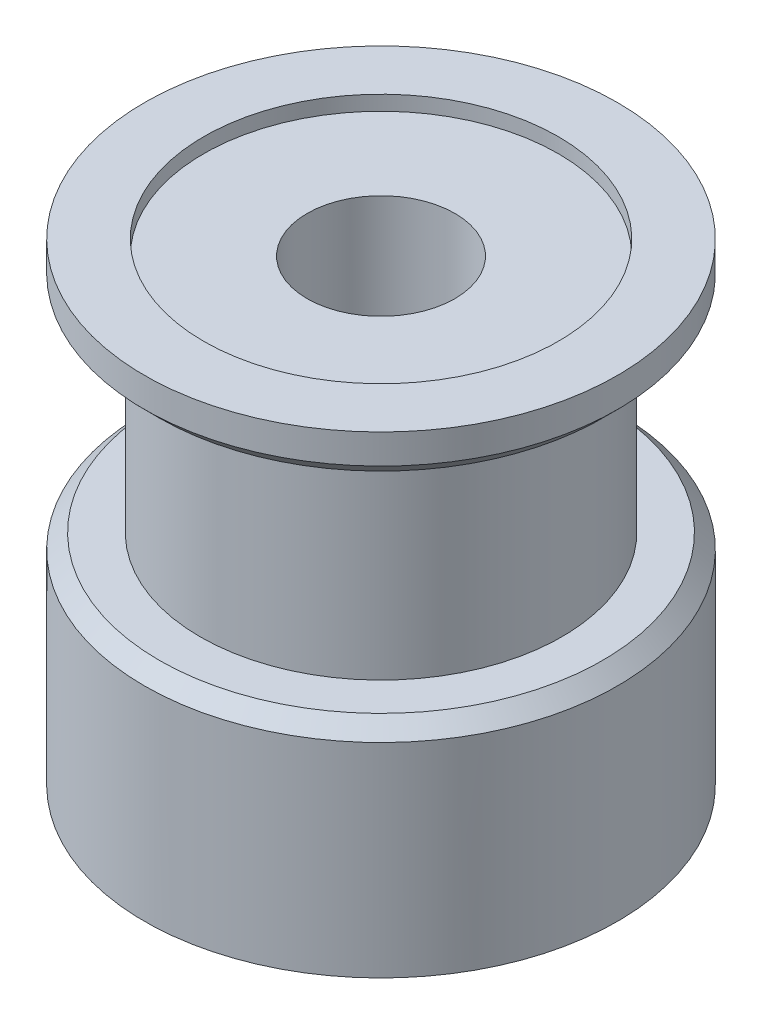
ISO-10303-21;
HEADER;
FILE_DESCRIPTION(('STEP AP214'),'2;1');
FILE_NAME('part.step','',(''),(''),'','','');
FILE_SCHEMA(('AUTOMOTIVE_DESIGN { 1 0 10303 214 1 1 1 1 }'));
ENDSEC;
DATA;
#1=APPLICATION_CONTEXT('core data for automotive mechanical design processes');
#2=APPLICATION_PROTOCOL_DEFINITION('international standard','automotive_design',2000,#1);
#3=PRODUCT_CONTEXT('',#1,'mechanical');
#4=PRODUCT('Part','Part','',(#3));
#5=PRODUCT_RELATED_PRODUCT_CATEGORY('part','',(#4));
#6=PRODUCT_DEFINITION_FORMATION('','',#4);
#7=PRODUCT_DEFINITION_CONTEXT('part definition',#1,'design');
#8=PRODUCT_DEFINITION('design','',#6,#7);
#9=PRODUCT_DEFINITION_SHAPE('','',#8);
#10=(LENGTH_UNIT() NAMED_UNIT(*) SI_UNIT(.MILLI.,.METRE.));
#11=(NAMED_UNIT(*) PLANE_ANGLE_UNIT() SI_UNIT($,.RADIAN.));
#12=(NAMED_UNIT(*) SI_UNIT($,.STERADIAN.) SOLID_ANGLE_UNIT());
#13=UNCERTAINTY_MEASURE_WITH_UNIT(LENGTH_MEASURE(1.E-05),#10,'distance_accuracy_value','');
#14=(GEOMETRIC_REPRESENTATION_CONTEXT(3) GLOBAL_UNCERTAINTY_ASSIGNED_CONTEXT((#13)) GLOBAL_UNIT_ASSIGNED_CONTEXT((#10,
#11,#12)) REPRESENTATION_CONTEXT('',''));
#15=CARTESIAN_POINT('',(0.,0.,0.));
#16=DIRECTION('',(0.,0.,1.));
#17=DIRECTION('',(1.,0.,0.));
#18=AXIS2_PLACEMENT_3D('',#15,#16,#17);
#19=CARTESIAN_POINT('',(0.,0.,0.));
#20=DIRECTION('',(0.,-1.,0.));
#21=DIRECTION('',(0.,0.,-1.));
#22=AXIS2_PLACEMENT_3D('',#19,#20,#21);
#23=CYLINDRICAL_SURFACE('',#22,2.5);
#24=CARTESIAN_POINT('',(0.,0.,0.));
#25=DIRECTION('',(0.,-1.,0.));
#26=DIRECTION('',(0.,0.,-1.));
#27=AXIS2_PLACEMENT_3D('',#24,#25,#26);
#28=CIRCLE('',#27,2.5);
#29=CARTESIAN_POINT('',(0.,0.,-2.5));
#30=VERTEX_POINT('',#29);
#31=EDGE_CURVE('E61',#30,#30,#28,.T.);
#32=ORIENTED_EDGE('',*,*,#31,.T.);
#33=EDGE_LOOP('',(#32));
#34=FACE_BOUND('',#33,.T.);
#35=CARTESIAN_POINT('',(0.,15.5,0.));
#36=DIRECTION('',(0.,1.,0.));
#37=DIRECTION('',(0.,0.,1.));
#38=AXIS2_PLACEMENT_3D('',#35,#36,#37);
#39=CIRCLE('',#38,2.5);
#40=CARTESIAN_POINT('',(0.,15.5,2.5));
#41=VERTEX_POINT('',#40);
#42=EDGE_CURVE('E45',#41,#41,#39,.T.);
#43=ORIENTED_EDGE('',*,*,#42,.T.);
#44=EDGE_LOOP('',(#43));
#45=FACE_BOUND('',#44,.T.);
#46=ADVANCED_FACE('F40',(#34,#45),#23,.F.);
#47=CARTESIAN_POINT('',(8.00000000000001,0.,0.));
#48=DIRECTION('',(0.,-1.,0.));
#49=DIRECTION('',(0.,0.,-1.));
#50=AXIS2_PLACEMENT_3D('',#47,#48,#49);
#51=PLANE('',#50);
#52=CARTESIAN_POINT('',(0.,0.,0.));
#53=DIRECTION('',(0.,-1.,0.));
#54=DIRECTION('',(0.,0.,-1.));
#55=AXIS2_PLACEMENT_3D('',#52,#53,#54);
#56=CIRCLE('',#55,8.00000000000001);
#57=CARTESIAN_POINT('',(0.,0.,-8.00000000000001));
#58=VERTEX_POINT('',#57);
#59=EDGE_CURVE('E73',#58,#58,#56,.T.);
#60=ORIENTED_EDGE('',*,*,#59,.T.);
#61=EDGE_LOOP('',(#60));
#62=FACE_BOUND('',#61,.T.);
#63=ORIENTED_EDGE('',*,*,#31,.F.);
#64=EDGE_LOOP('',(#63));
#65=FACE_BOUND('',#64,.T.);
#66=ADVANCED_FACE('F97',(#62,#65),#51,.T.);
#67=CARTESIAN_POINT('',(2.5,16.,0.));
#68=DIRECTION('',(0.,1.,0.));
#69=DIRECTION('',(0.,0.,1.));
#70=AXIS2_PLACEMENT_3D('',#67,#68,#69);
#71=PLANE('',#70);
#72=CARTESIAN_POINT('',(0.,16.,0.));
#73=DIRECTION('',(0.,1.,0.));
#74=DIRECTION('',(0.,0.,1.));
#75=AXIS2_PLACEMENT_3D('',#72,#73,#74);
#76=CIRCLE('',#75,6.);
#77=CARTESIAN_POINT('',(0.,16.,6.));
#78=VERTEX_POINT('',#77);
#79=EDGE_CURVE('E76',#78,#78,#76,.T.);
#80=ORIENTED_EDGE('',*,*,#79,.F.);
#81=EDGE_LOOP('',(#80));
#82=FACE_BOUND('',#81,.T.);
#83=CARTESIAN_POINT('',(0.,16.,0.));
#84=DIRECTION('',(0.,-1.,0.));
#85=DIRECTION('',(0.,0.,-1.));
#86=AXIS2_PLACEMENT_3D('',#83,#84,#85);
#87=CIRCLE('',#86,8.);
#88=CARTESIAN_POINT('',(0.,16.,-8.));
#89=VERTEX_POINT('',#88);
#90=EDGE_CURVE('E64',#89,#89,#87,.T.);
#91=ORIENTED_EDGE('',*,*,#90,.F.);
#92=EDGE_LOOP('',(#91));
#93=FACE_BOUND('',#92,.T.);
#94=ADVANCED_FACE('F103',(#82,#93),#71,.T.);
#95=CARTESIAN_POINT('',(0.,0.,0.));
#96=DIRECTION('',(0.,-1.,0.));
#97=DIRECTION('',(0.,0.,-1.));
#98=AXIS2_PLACEMENT_3D('',#95,#96,#97);
#99=CYLINDRICAL_SURFACE('',#98,8.);
#100=CARTESIAN_POINT('',(0.,15.,0.));
#101=DIRECTION('',(0.,-1.,0.));
#102=DIRECTION('',(0.,0.,-1.));
#103=AXIS2_PLACEMENT_3D('',#100,#101,#102);
#104=CIRCLE('',#103,8.);
#105=CARTESIAN_POINT('',(0.,15.,-8.));
#106=VERTEX_POINT('',#105);
#107=EDGE_CURVE('E53',#106,#106,#104,.F.);
#108=ORIENTED_EDGE('',*,*,#107,.T.);
#109=EDGE_LOOP('',(#108));
#110=FACE_BOUND('',#109,.T.);
#111=ORIENTED_EDGE('',*,*,#90,.T.);
#112=EDGE_LOOP('',(#111));
#113=FACE_BOUND('',#112,.T.);
#114=ADVANCED_FACE('F131',(#110,#113),#99,.T.);
#115=CARTESIAN_POINT('',(8.,14.5,0.));
#116=DIRECTION('',(0.,-1.,0.));
#117=DIRECTION('',(0.,0.,-1.));
#118=AXIS2_PLACEMENT_3D('',#115,#116,#117);
#119=PLANE('',#118);
#120=CARTESIAN_POINT('',(0.,14.5,0.));
#121=DIRECTION('',(0.,-1.,0.));
#122=DIRECTION('',(0.,0.,-1.));
#123=AXIS2_PLACEMENT_3D('',#120,#121,#122);
#124=CIRCLE('',#123,7.50000000000001);
#125=CARTESIAN_POINT('',(0.,14.5,-7.50000000000001));
#126=VERTEX_POINT('',#125);
#127=EDGE_CURVE('E58',#126,#126,#124,.T.);
#128=ORIENTED_EDGE('',*,*,#127,.T.);
#129=EDGE_LOOP('',(#128));
#130=FACE_BOUND('',#129,.T.);
#131=CARTESIAN_POINT('',(0.,14.5,0.));
#132=DIRECTION('',(0.,-1.,0.));
#133=DIRECTION('',(0.,0.,-1.));
#134=AXIS2_PLACEMENT_3D('',#131,#132,#133);
#135=CIRCLE('',#134,6.12);
#136=CARTESIAN_POINT('',(0.,14.5,-6.12));
#137=VERTEX_POINT('',#136);
#138=EDGE_CURVE('E67',#137,#137,#135,.T.);
#139=ORIENTED_EDGE('',*,*,#138,.F.);
#140=EDGE_LOOP('',(#139));
#141=FACE_BOUND('',#140,.T.);
#142=ADVANCED_FACE('F127',(#130,#141),#119,.T.);
#143=CARTESIAN_POINT('',(0.,0.,0.));
#144=DIRECTION('',(0.,-1.,0.));
#145=DIRECTION('',(0.,0.,-1.));
#146=AXIS2_PLACEMENT_3D('',#143,#144,#145);
#147=CYLINDRICAL_SURFACE('',#146,6.12);
#148=ORIENTED_EDGE('',*,*,#138,.T.);
#149=EDGE_LOOP('',(#148));
#150=FACE_BOUND('',#149,.T.);
#151=CARTESIAN_POINT('',(0.,7.4,0.));
#152=DIRECTION('',(0.,-1.,0.));
#153=DIRECTION('',(0.,0.,-1.));
#154=AXIS2_PLACEMENT_3D('',#151,#152,#153);
#155=CIRCLE('',#154,6.12);
#156=CARTESIAN_POINT('',(0.,7.4,-6.12));
#157=VERTEX_POINT('',#156);
#158=EDGE_CURVE('E70',#157,#157,#155,.T.);
#159=ORIENTED_EDGE('',*,*,#158,.F.);
#160=EDGE_LOOP('',(#159));
#161=FACE_BOUND('',#160,.T.);
#162=ADVANCED_FACE('F130',(#150,#161),#147,.T.);
#163=CARTESIAN_POINT('',(6.12,7.4,0.));
#164=DIRECTION('',(0.,1.,0.));
#165=DIRECTION('',(0.,0.,1.));
#166=AXIS2_PLACEMENT_3D('',#163,#164,#165);
#167=PLANE('',#166);
#168=CARTESIAN_POINT('',(0.,7.4,0.));
#169=DIRECTION('',(0.,1.,0.));
#170=DIRECTION('',(0.,0.,1.));
#171=AXIS2_PLACEMENT_3D('',#168,#169,#170);
#172=CIRCLE('',#171,7.50000000000001);
#173=CARTESIAN_POINT('',(0.,7.4,7.50000000000001));
#174=VERTEX_POINT('',#173);
#175=EDGE_CURVE('E10',#174,#174,#172,.T.);
#176=ORIENTED_EDGE('',*,*,#175,.T.);
#177=EDGE_LOOP('',(#176));
#178=FACE_BOUND('',#177,.T.);
#179=ORIENTED_EDGE('',*,*,#158,.T.);
#180=EDGE_LOOP('',(#179));
#181=FACE_BOUND('',#180,.T.);
#182=ADVANCED_FACE('F120',(#178,#181),#167,.T.);
#183=CARTESIAN_POINT('',(0.,0.,0.));
#184=DIRECTION('',(0.,-1.,0.));
#185=DIRECTION('',(0.,0.,-1.));
#186=AXIS2_PLACEMENT_3D('',#183,#184,#185);
#187=CYLINDRICAL_SURFACE('',#186,8.00000000000001);
#188=CARTESIAN_POINT('',(0.,6.9,0.));
#189=DIRECTION('',(0.,1.,0.));
#190=DIRECTION('',(0.,0.,1.));
#191=AXIS2_PLACEMENT_3D('',#188,#189,#190);
#192=CIRCLE('',#191,8.00000000000001);
#193=CARTESIAN_POINT('',(0.,6.9,8.00000000000001));
#194=VERTEX_POINT('',#193);
#195=EDGE_CURVE('E49',#194,#194,#192,.F.);
#196=ORIENTED_EDGE('',*,*,#195,.T.);
#197=EDGE_LOOP('',(#196));
#198=FACE_BOUND('',#197,.T.);
#199=ORIENTED_EDGE('',*,*,#59,.F.);
#200=EDGE_LOOP('',(#199));
#201=FACE_BOUND('',#200,.T.);
#202=ADVANCED_FACE('F113',(#198,#201),#187,.T.);
#203=CARTESIAN_POINT('',(0.,14.5,0.));
#204=DIRECTION('',(0.,1.,0.));
#205=DIRECTION('',(0.,0.,1.));
#206=AXIS2_PLACEMENT_3D('',#203,#204,#205);
#207=CONICAL_SURFACE('',#206,7.50000000000001,0.785398163397445);
#208=ORIENTED_EDGE('',*,*,#107,.F.);
#209=EDGE_LOOP('',(#208));
#210=FACE_BOUND('',#209,.T.);
#211=ORIENTED_EDGE('',*,*,#127,.F.);
#212=EDGE_LOOP('',(#211));
#213=FACE_BOUND('',#212,.T.);
#214=ADVANCED_FACE('F109',(#210,#213),#207,.T.);
#215=CARTESIAN_POINT('',(0.,6.9,0.));
#216=DIRECTION('',(0.,-1.,0.));
#217=DIRECTION('',(0.,0.,-1.));
#218=AXIS2_PLACEMENT_3D('',#215,#216,#217);
#219=CONICAL_SURFACE('',#218,8.00000000000001,0.785398163397452);
#220=ORIENTED_EDGE('',*,*,#175,.F.);
#221=EDGE_LOOP('',(#220));
#222=FACE_BOUND('',#221,.T.);
#223=ORIENTED_EDGE('',*,*,#195,.F.);
#224=EDGE_LOOP('',(#223));
#225=FACE_BOUND('',#224,.T.);
#226=ADVANCED_FACE('F43',(#222,#225),#219,.T.);
#227=CARTESIAN_POINT('',(0.,15.5,0.));
#228=DIRECTION('',(0.,1.,0.));
#229=DIRECTION('',(0.,0.,1.));
#230=AXIS2_PLACEMENT_3D('',#227,#228,#229);
#231=CYLINDRICAL_SURFACE('',#230,6.);
#232=CARTESIAN_POINT('',(0.,15.5,0.));
#233=DIRECTION('',(0.,1.,0.));
#234=DIRECTION('',(0.,0.,1.));
#235=AXIS2_PLACEMENT_3D('',#232,#233,#234);
#236=CIRCLE('',#235,6.);
#237=CARTESIAN_POINT('',(0.,15.5,6.));
#238=VERTEX_POINT('',#237);
#239=EDGE_CURVE('E79',#238,#238,#236,.T.);
#240=ORIENTED_EDGE('',*,*,#239,.F.);
#241=EDGE_LOOP('',(#240));
#242=FACE_BOUND('',#241,.T.);
#243=ORIENTED_EDGE('',*,*,#79,.T.);
#244=EDGE_LOOP('',(#243));
#245=FACE_BOUND('',#244,.T.);
#246=ADVANCED_FACE('F89',(#242,#245),#231,.F.);
#247=CARTESIAN_POINT('',(0.,15.5,0.));
#248=DIRECTION('',(0.,1.,0.));
#249=DIRECTION('',(0.,0.,1.));
#250=AXIS2_PLACEMENT_3D('',#247,#248,#249);
#251=PLANE('',#250);
#252=ORIENTED_EDGE('',*,*,#42,.F.);
#253=EDGE_LOOP('',(#252));
#254=FACE_BOUND('',#253,.T.);
#255=ORIENTED_EDGE('',*,*,#239,.T.);
#256=EDGE_LOOP('',(#255));
#257=FACE_BOUND('',#256,.T.);
#258=ADVANCED_FACE('F87',(#254,#257),#251,.T.);
#259=CLOSED_SHELL('',(#46,#66,#94,#114,#142,#162,#182,#202,#214,#226,#246,#258));
#260=MANIFOLD_SOLID_BREP('B2',#259);
#261=ADVANCED_BREP_SHAPE_REPRESENTATION('',(#18,#260),#14);
#262=SHAPE_DEFINITION_REPRESENTATION(#9,#261);
ENDSEC;
END-ISO-10303-21;
